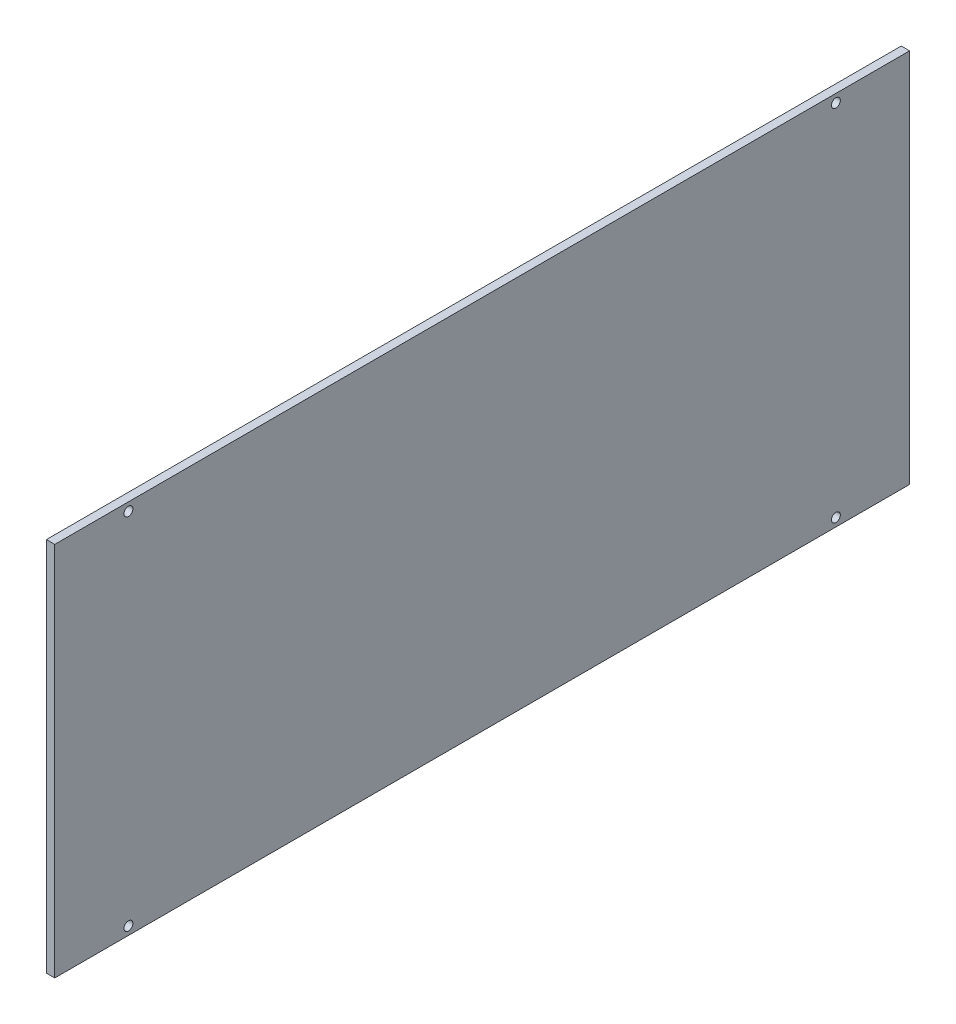
ISO-10303-21;
HEADER;
FILE_DESCRIPTION(('STEP AP214'),'2;1');
FILE_NAME('part.step','',(''),(''),'','','');
FILE_SCHEMA(('AUTOMOTIVE_DESIGN { 1 0 10303 214 1 1 1 1 }'));
ENDSEC;
DATA;
#1=APPLICATION_CONTEXT('core data for automotive mechanical design processes');
#2=APPLICATION_PROTOCOL_DEFINITION('international standard','automotive_design',2000,#1);
#3=PRODUCT_CONTEXT('',#1,'mechanical');
#4=PRODUCT('Part','Part','',(#3));
#5=PRODUCT_RELATED_PRODUCT_CATEGORY('part','',(#4));
#6=PRODUCT_DEFINITION_FORMATION('','',#4);
#7=PRODUCT_DEFINITION_CONTEXT('part definition',#1,'design');
#8=PRODUCT_DEFINITION('design','',#6,#7);
#9=PRODUCT_DEFINITION_SHAPE('','',#8);
#10=(LENGTH_UNIT() NAMED_UNIT(*) SI_UNIT(.MILLI.,.METRE.));
#11=(NAMED_UNIT(*) PLANE_ANGLE_UNIT() SI_UNIT($,.RADIAN.));
#12=(NAMED_UNIT(*) SI_UNIT($,.STERADIAN.) SOLID_ANGLE_UNIT());
#13=UNCERTAINTY_MEASURE_WITH_UNIT(LENGTH_MEASURE(1.E-05),#10,'distance_accuracy_value','');
#14=(GEOMETRIC_REPRESENTATION_CONTEXT(3) GLOBAL_UNCERTAINTY_ASSIGNED_CONTEXT((#13)) GLOBAL_UNIT_ASSIGNED_CONTEXT((#10,
#11,#12)) REPRESENTATION_CONTEXT('',''));
#15=CARTESIAN_POINT('',(0.,0.,0.));
#16=DIRECTION('',(0.,0.,1.));
#17=DIRECTION('',(1.,0.,0.));
#18=AXIS2_PLACEMENT_3D('',#15,#16,#17);
#19=CARTESIAN_POINT('',(-258.464312824647,134.693154424768,138.889594997104));
#20=DIRECTION('',(0.,0.,1.));
#21=DIRECTION('',(0.,-1.,0.));
#22=AXIS2_PLACEMENT_3D('',#19,#20,#21);
#23=PLANE('',#22);
#24=DIRECTION('',(0.,1.,0.));
#25=VECTOR('',#24,1.);
#26=CARTESIAN_POINT('',(-261.294312824647,134.693154424768,138.889594997104));
#27=LINE('',#26,#25);
#28=CARTESIAN_POINT('',(-261.294312824647,7.29315442476767,138.889594997105));
#29=VERTEX_POINT('',#28);
#30=CARTESIAN_POINT('',(-261.294312824647,134.693154424768,138.889594997104));
#31=VERTEX_POINT('',#30);
#32=EDGE_CURVE('E98',#29,#31,#27,.T.);
#33=ORIENTED_EDGE('',*,*,#32,.F.);
#34=DIRECTION('',(-1.,0.,0.));
#35=VECTOR('',#34,1.);
#36=CARTESIAN_POINT('',(-258.464312824647,7.29315442476767,138.889594997105));
#37=LINE('',#36,#35);
#38=CARTESIAN_POINT('',(-258.464312824647,7.29315442476767,138.889594997105));
#39=VERTEX_POINT('',#38);
#40=EDGE_CURVE('E11',#39,#29,#37,.T.);
#41=ORIENTED_EDGE('',*,*,#40,.F.);
#42=DIRECTION('',(0.,1.,0.));
#43=VECTOR('',#42,1.);
#44=CARTESIAN_POINT('',(-258.464312824647,134.693154424768,138.889594997104));
#45=LINE('',#44,#43);
#46=CARTESIAN_POINT('',(-258.464312824647,134.693154424768,138.889594997104));
#47=VERTEX_POINT('',#46);
#48=EDGE_CURVE('E91',#39,#47,#45,.T.);
#49=ORIENTED_EDGE('',*,*,#48,.T.);
#50=DIRECTION('',(-1.,0.,0.));
#51=VECTOR('',#50,1.);
#52=CARTESIAN_POINT('',(-258.464312824647,134.693154424768,138.889594997104));
#53=LINE('',#52,#51);
#54=EDGE_CURVE('E36',#47,#31,#53,.T.);
#55=ORIENTED_EDGE('',*,*,#54,.T.);
#56=EDGE_LOOP('',(#33,#41,#49,#55));
#57=FACE_BOUND('',#56,.T.);
#58=ADVANCED_FACE('F33',(#57),#23,.T.);
#59=CARTESIAN_POINT('',(-258.464312824647,7.29315442476767,138.889594997105));
#60=DIRECTION('',(0.,-1.,0.));
#61=DIRECTION('',(0.,0.,-1.));
#62=AXIS2_PLACEMENT_3D('',#59,#60,#61);
#63=PLANE('',#62);
#64=DIRECTION('',(0.,0.,1.));
#65=VECTOR('',#64,1.);
#66=CARTESIAN_POINT('',(-261.294312824647,7.29315442476767,138.889594997105));
#67=LINE('',#66,#65);
#68=CARTESIAN_POINT('',(-261.294312824647,7.29315442476763,-151.110405002896));
#69=VERTEX_POINT('',#68);
#70=EDGE_CURVE('E93',#69,#29,#67,.T.);
#71=ORIENTED_EDGE('',*,*,#70,.F.);
#72=DIRECTION('',(-1.,0.,0.));
#73=VECTOR('',#72,1.);
#74=CARTESIAN_POINT('',(-258.464312824647,7.29315442476763,-151.110405002896));
#75=LINE('',#74,#73);
#76=CARTESIAN_POINT('',(-258.464312824647,7.29315442476763,-151.110405002896));
#77=VERTEX_POINT('',#76);
#78=EDGE_CURVE('E42',#77,#69,#75,.T.);
#79=ORIENTED_EDGE('',*,*,#78,.F.);
#80=DIRECTION('',(0.,0.,1.));
#81=VECTOR('',#80,1.);
#82=CARTESIAN_POINT('',(-258.464312824647,7.29315442476767,138.889594997105));
#83=LINE('',#82,#81);
#84=EDGE_CURVE('E88',#77,#39,#83,.T.);
#85=ORIENTED_EDGE('',*,*,#84,.T.);
#86=ORIENTED_EDGE('',*,*,#40,.T.);
#87=EDGE_LOOP('',(#71,#79,#85,#86));
#88=FACE_BOUND('',#87,.T.);
#89=ADVANCED_FACE('F109',(#88),#63,.T.);
#90=CARTESIAN_POINT('',(-258.464312824647,134.693154424768,-151.110405002896));
#91=DIRECTION('',(0.,0.,-1.));
#92=DIRECTION('',(0.,1.,0.));
#93=AXIS2_PLACEMENT_3D('',#90,#91,#92);
#94=PLANE('',#93);
#95=DIRECTION('',(0.,-1.,0.));
#96=VECTOR('',#95,1.);
#97=CARTESIAN_POINT('',(-261.294312824647,134.693154424768,-151.110405002896));
#98=LINE('',#97,#96);
#99=CARTESIAN_POINT('',(-261.294312824647,134.693154424768,-151.110405002896));
#100=VERTEX_POINT('',#99);
#101=EDGE_CURVE('E83',#100,#69,#98,.T.);
#102=ORIENTED_EDGE('',*,*,#101,.F.);
#103=DIRECTION('',(-1.,0.,0.));
#104=VECTOR('',#103,1.);
#105=CARTESIAN_POINT('',(-258.464312824647,134.693154424768,-151.110405002896));
#106=LINE('',#105,#104);
#107=CARTESIAN_POINT('',(-258.464312824647,134.693154424768,-151.110405002896));
#108=VERTEX_POINT('',#107);
#109=EDGE_CURVE('E78',#108,#100,#106,.T.);
#110=ORIENTED_EDGE('',*,*,#109,.F.);
#111=DIRECTION('',(0.,-1.,0.));
#112=VECTOR('',#111,1.);
#113=CARTESIAN_POINT('',(-258.464312824647,134.693154424768,-151.110405002896));
#114=LINE('',#113,#112);
#115=EDGE_CURVE('E81',#108,#77,#114,.T.);
#116=ORIENTED_EDGE('',*,*,#115,.T.);
#117=ORIENTED_EDGE('',*,*,#78,.T.);
#118=EDGE_LOOP('',(#102,#110,#116,#117));
#119=FACE_BOUND('',#118,.T.);
#120=ADVANCED_FACE('F80',(#119),#94,.T.);
#121=CARTESIAN_POINT('',(-258.464312824647,134.693154424768,138.889594997104));
#122=DIRECTION('',(0.,1.,0.));
#123=DIRECTION('',(0.,0.,1.));
#124=AXIS2_PLACEMENT_3D('',#121,#122,#123);
#125=PLANE('',#124);
#126=DIRECTION('',(0.,0.,-1.));
#127=VECTOR('',#126,1.);
#128=CARTESIAN_POINT('',(-261.294312824647,134.693154424768,138.889594997104));
#129=LINE('',#128,#127);
#130=EDGE_CURVE('E101',#31,#100,#129,.T.);
#131=ORIENTED_EDGE('',*,*,#130,.F.);
#132=ORIENTED_EDGE('',*,*,#54,.F.);
#133=DIRECTION('',(0.,0.,-1.));
#134=VECTOR('',#133,1.);
#135=CARTESIAN_POINT('',(-258.464312824647,134.693154424768,138.889594997104));
#136=LINE('',#135,#134);
#137=EDGE_CURVE('E87',#47,#108,#136,.T.);
#138=ORIENTED_EDGE('',*,*,#137,.T.);
#139=ORIENTED_EDGE('',*,*,#109,.T.);
#140=EDGE_LOOP('',(#131,#132,#138,#139));
#141=FACE_BOUND('',#140,.T.);
#142=ADVANCED_FACE('F90',(#141),#125,.T.);
#143=CARTESIAN_POINT('',(-258.464312824647,0.,0.));
#144=DIRECTION('',(1.,0.,0.));
#145=DIRECTION('',(0.,0.,-1.));
#146=AXIS2_PLACEMENT_3D('',#143,#144,#145);
#147=PLANE('',#146);
#148=CARTESIAN_POINT('',(-258.464312824647,10.0931544247677,113.889594997105));
#149=DIRECTION('',(-1.,0.,0.));
#150=DIRECTION('',(0.,0.,-1.));
#151=AXIS2_PLACEMENT_3D('',#148,#149,#150);
#152=CIRCLE('',#151,1.5);
#153=CARTESIAN_POINT('',(-258.464312824647,10.0931544247677,112.389594997105));
#154=VERTEX_POINT('',#153);
#155=EDGE_CURVE('E150',#154,#154,#152,.T.);
#156=ORIENTED_EDGE('',*,*,#155,.T.);
#157=EDGE_LOOP('',(#156));
#158=FACE_BOUND('',#157,.T.);
#159=CARTESIAN_POINT('',(-258.464312824647,10.0931544247677,-126.110405002896));
#160=DIRECTION('',(-1.,0.,0.));
#161=DIRECTION('',(0.,0.,-1.));
#162=AXIS2_PLACEMENT_3D('',#159,#160,#161);
#163=CIRCLE('',#162,1.5);
#164=CARTESIAN_POINT('',(-258.464312824647,10.0931544247677,-127.610405002896));
#165=VERTEX_POINT('',#164);
#166=EDGE_CURVE('E158',#165,#165,#163,.T.);
#167=ORIENTED_EDGE('',*,*,#166,.T.);
#168=EDGE_LOOP('',(#167));
#169=FACE_BOUND('',#168,.T.);
#170=CARTESIAN_POINT('',(-258.464312824647,131.893154424768,-126.110405002896));
#171=DIRECTION('',(-1.,0.,0.));
#172=DIRECTION('',(0.,0.,1.));
#173=AXIS2_PLACEMENT_3D('',#170,#171,#172);
#174=CIRCLE('',#173,1.5);
#175=CARTESIAN_POINT('',(-258.464312824647,131.893154424768,-124.610405002895));
#176=VERTEX_POINT('',#175);
#177=EDGE_CURVE('E164',#176,#176,#174,.T.);
#178=ORIENTED_EDGE('',*,*,#177,.T.);
#179=EDGE_LOOP('',(#178));
#180=FACE_BOUND('',#179,.T.);
#181=CARTESIAN_POINT('',(-258.464312824647,131.893154424768,113.889594997104));
#182=DIRECTION('',(-1.,0.,0.));
#183=DIRECTION('',(0.,0.,1.));
#184=AXIS2_PLACEMENT_3D('',#181,#182,#183);
#185=CIRCLE('',#184,1.5);
#186=CARTESIAN_POINT('',(-258.464312824647,131.893154424768,115.389594997104));
#187=VERTEX_POINT('',#186);
#188=EDGE_CURVE('E102',#187,#187,#185,.T.);
#189=ORIENTED_EDGE('',*,*,#188,.T.);
#190=EDGE_LOOP('',(#189));
#191=FACE_BOUND('',#190,.T.);
#192=ORIENTED_EDGE('',*,*,#48,.F.);
#193=ORIENTED_EDGE('',*,*,#84,.F.);
#194=ORIENTED_EDGE('',*,*,#115,.F.);
#195=ORIENTED_EDGE('',*,*,#137,.F.);
#196=EDGE_LOOP('',(#192,#193,#194,#195));
#197=FACE_BOUND('',#196,.T.);
#198=ADVANCED_FACE('F86',(#158,#169,#180,#191,#197),#147,.T.);
#199=CARTESIAN_POINT('',(-261.294312824647,0.,0.));
#200=DIRECTION('',(1.,0.,0.));
#201=DIRECTION('',(0.,0.,-1.));
#202=AXIS2_PLACEMENT_3D('',#199,#200,#201);
#203=PLANE('',#202);
#204=CARTESIAN_POINT('',(-261.294312824647,10.0931544247677,113.889594997105));
#205=DIRECTION('',(-1.,0.,0.));
#206=DIRECTION('',(0.,0.,-1.));
#207=AXIS2_PLACEMENT_3D('',#204,#205,#206);
#208=CIRCLE('',#207,1.5);
#209=CARTESIAN_POINT('',(-261.294312824647,10.0931544247677,112.389594997105));
#210=VERTEX_POINT('',#209);
#211=EDGE_CURVE('E153',#210,#210,#208,.T.);
#212=ORIENTED_EDGE('',*,*,#211,.F.);
#213=EDGE_LOOP('',(#212));
#214=FACE_BOUND('',#213,.T.);
#215=CARTESIAN_POINT('',(-261.294312824647,10.0931544247677,-126.110405002896));
#216=DIRECTION('',(-1.,0.,0.));
#217=DIRECTION('',(0.,0.,-1.));
#218=AXIS2_PLACEMENT_3D('',#215,#216,#217);
#219=CIRCLE('',#218,1.5);
#220=CARTESIAN_POINT('',(-261.294312824647,10.0931544247677,-127.610405002896));
#221=VERTEX_POINT('',#220);
#222=EDGE_CURVE('E155',#221,#221,#219,.T.);
#223=ORIENTED_EDGE('',*,*,#222,.F.);
#224=EDGE_LOOP('',(#223));
#225=FACE_BOUND('',#224,.T.);
#226=CARTESIAN_POINT('',(-261.294312824647,131.893154424768,-126.110405002896));
#227=DIRECTION('',(-1.,0.,0.));
#228=DIRECTION('',(0.,0.,1.));
#229=AXIS2_PLACEMENT_3D('',#226,#227,#228);
#230=CIRCLE('',#229,1.5);
#231=CARTESIAN_POINT('',(-261.294312824647,131.893154424768,-124.610405002895));
#232=VERTEX_POINT('',#231);
#233=EDGE_CURVE('E161',#232,#232,#230,.T.);
#234=ORIENTED_EDGE('',*,*,#233,.F.);
#235=EDGE_LOOP('',(#234));
#236=FACE_BOUND('',#235,.T.);
#237=CARTESIAN_POINT('',(-261.294312824647,131.893154424768,113.889594997104));
#238=DIRECTION('',(-1.,0.,0.));
#239=DIRECTION('',(0.,0.,1.));
#240=AXIS2_PLACEMENT_3D('',#237,#238,#239);
#241=CIRCLE('',#240,1.5);
#242=CARTESIAN_POINT('',(-261.294312824647,131.893154424768,115.389594997104));
#243=VERTEX_POINT('',#242);
#244=EDGE_CURVE('E167',#243,#243,#241,.T.);
#245=ORIENTED_EDGE('',*,*,#244,.F.);
#246=EDGE_LOOP('',(#245));
#247=FACE_BOUND('',#246,.T.);
#248=ORIENTED_EDGE('',*,*,#32,.T.);
#249=ORIENTED_EDGE('',*,*,#130,.T.);
#250=ORIENTED_EDGE('',*,*,#101,.T.);
#251=ORIENTED_EDGE('',*,*,#70,.T.);
#252=EDGE_LOOP('',(#248,#249,#250,#251));
#253=FACE_BOUND('',#252,.T.);
#254=ADVANCED_FACE('F108',(#214,#225,#236,#247,#253),#203,.F.);
#255=CARTESIAN_POINT('',(-258.464312824647,131.893154424768,113.889594997104));
#256=DIRECTION('',(-1.,0.,0.));
#257=DIRECTION('',(0.,0.,1.));
#258=AXIS2_PLACEMENT_3D('',#255,#256,#257);
#259=CYLINDRICAL_SURFACE('',#258,1.5);
#260=ORIENTED_EDGE('',*,*,#188,.F.);
#261=EDGE_LOOP('',(#260));
#262=FACE_BOUND('',#261,.T.);
#263=ORIENTED_EDGE('',*,*,#244,.T.);
#264=EDGE_LOOP('',(#263));
#265=FACE_BOUND('',#264,.T.);
#266=ADVANCED_FACE('F127',(#262,#265),#259,.F.);
#267=CARTESIAN_POINT('',(-258.464312824647,131.893154424768,-126.110405002896));
#268=DIRECTION('',(-1.,0.,0.));
#269=DIRECTION('',(0.,0.,1.));
#270=AXIS2_PLACEMENT_3D('',#267,#268,#269);
#271=CYLINDRICAL_SURFACE('',#270,1.5);
#272=ORIENTED_EDGE('',*,*,#177,.F.);
#273=EDGE_LOOP('',(#272));
#274=FACE_BOUND('',#273,.T.);
#275=ORIENTED_EDGE('',*,*,#233,.T.);
#276=EDGE_LOOP('',(#275));
#277=FACE_BOUND('',#276,.T.);
#278=ADVANCED_FACE('F134',(#274,#277),#271,.F.);
#279=CARTESIAN_POINT('',(-258.464312824647,10.0931544247677,-126.110405002896));
#280=DIRECTION('',(-1.,0.,0.));
#281=DIRECTION('',(0.,0.,1.));
#282=AXIS2_PLACEMENT_3D('',#279,#280,#281);
#283=CYLINDRICAL_SURFACE('',#282,1.5);
#284=ORIENTED_EDGE('',*,*,#166,.F.);
#285=EDGE_LOOP('',(#284));
#286=FACE_BOUND('',#285,.T.);
#287=ORIENTED_EDGE('',*,*,#222,.T.);
#288=EDGE_LOOP('',(#287));
#289=FACE_BOUND('',#288,.T.);
#290=ADVANCED_FACE('F138',(#286,#289),#283,.F.);
#291=CARTESIAN_POINT('',(-258.464312824647,10.0931544247677,113.889594997105));
#292=DIRECTION('',(-1.,0.,0.));
#293=DIRECTION('',(0.,0.,1.));
#294=AXIS2_PLACEMENT_3D('',#291,#292,#293);
#295=CYLINDRICAL_SURFACE('',#294,1.5);
#296=ORIENTED_EDGE('',*,*,#155,.F.);
#297=EDGE_LOOP('',(#296));
#298=FACE_BOUND('',#297,.T.);
#299=ORIENTED_EDGE('',*,*,#211,.T.);
#300=EDGE_LOOP('',(#299));
#301=FACE_BOUND('',#300,.T.);
#302=ADVANCED_FACE('F142',(#298,#301),#295,.F.);
#303=CLOSED_SHELL('',(#58,#89,#120,#142,#198,#254,#266,#278,#290,#302));
#304=MANIFOLD_SOLID_BREP('B2',#303);
#305=ADVANCED_BREP_SHAPE_REPRESENTATION('',(#18,#304),#14);
#306=SHAPE_DEFINITION_REPRESENTATION(#9,#305);
ENDSEC;
END-ISO-10303-21;
